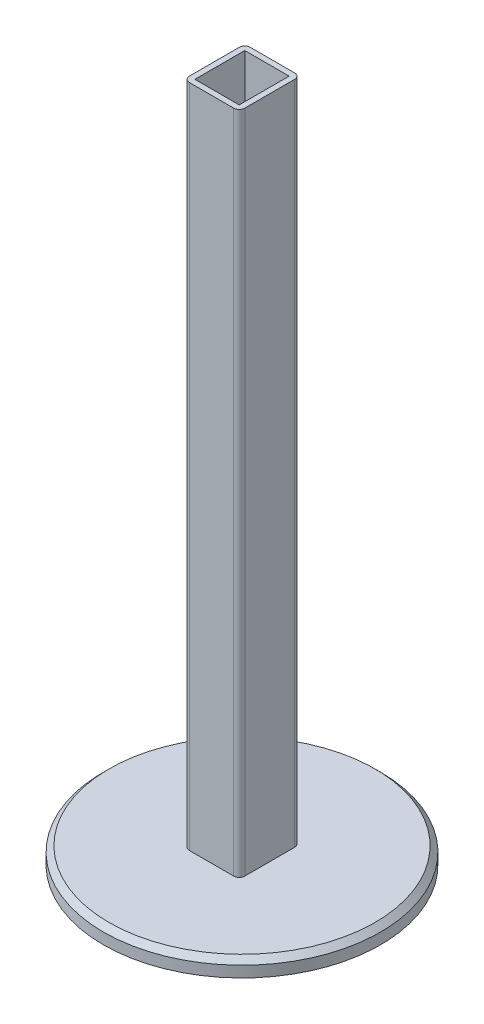
ISO-10303-21;
HEADER;
FILE_DESCRIPTION(('STEP AP214'),'2;1');
FILE_NAME('part.step','',(''),(''),'','','');
FILE_SCHEMA(('AUTOMOTIVE_DESIGN { 1 0 10303 214 1 1 1 1 }'));
ENDSEC;
DATA;
#1=APPLICATION_CONTEXT('core data for automotive mechanical design processes');
#2=APPLICATION_PROTOCOL_DEFINITION('international standard','automotive_design',2000,#1);
#3=PRODUCT_CONTEXT('',#1,'mechanical');
#4=PRODUCT('Part','Part','',(#3));
#5=PRODUCT_RELATED_PRODUCT_CATEGORY('part','',(#4));
#6=PRODUCT_DEFINITION_FORMATION('','',#4);
#7=PRODUCT_DEFINITION_CONTEXT('part definition',#1,'design');
#8=PRODUCT_DEFINITION('design','',#6,#7);
#9=PRODUCT_DEFINITION_SHAPE('','',#8);
#10=(LENGTH_UNIT() NAMED_UNIT(*) SI_UNIT(.MILLI.,.METRE.));
#11=(NAMED_UNIT(*) PLANE_ANGLE_UNIT() SI_UNIT($,.RADIAN.));
#12=(NAMED_UNIT(*) SI_UNIT($,.STERADIAN.) SOLID_ANGLE_UNIT());
#13=UNCERTAINTY_MEASURE_WITH_UNIT(LENGTH_MEASURE(1.E-05),#10,'distance_accuracy_value','');
#14=(GEOMETRIC_REPRESENTATION_CONTEXT(3) GLOBAL_UNCERTAINTY_ASSIGNED_CONTEXT((#13)) GLOBAL_UNIT_ASSIGNED_CONTEXT((#10,
#11,#12)) REPRESENTATION_CONTEXT('',''));
#15=CARTESIAN_POINT('',(0.,0.,0.));
#16=DIRECTION('',(0.,0.,1.));
#17=DIRECTION('',(1.,0.,0.));
#18=AXIS2_PLACEMENT_3D('',#15,#16,#17);
#19=CARTESIAN_POINT('',(0.,30.,0.));
#20=DIRECTION('',(0.,-1.,0.));
#21=DIRECTION('',(0.,0.,-1.));
#22=AXIS2_PLACEMENT_3D('',#19,#20,#21);
#23=CYLINDRICAL_SURFACE('',#22,250.);
#24=CARTESIAN_POINT('',(0.,20.0000000000001,0.));
#25=DIRECTION('',(0.,1.,0.));
#26=DIRECTION('',(0.,0.,1.));
#27=AXIS2_PLACEMENT_3D('',#24,#25,#26);
#28=CIRCLE('',#27,250.);
#29=CARTESIAN_POINT('',(0.,20.0000000000001,250.));
#30=VERTEX_POINT('',#29);
#31=EDGE_CURVE('E190',#30,#30,#28,.F.);
#32=ORIENTED_EDGE('',*,*,#31,.T.);
#33=EDGE_LOOP('',(#32));
#34=FACE_BOUND('',#33,.T.);
#35=CARTESIAN_POINT('',(0.,0.,0.));
#36=DIRECTION('',(0.,1.,0.));
#37=DIRECTION('',(0.,0.,1.));
#38=AXIS2_PLACEMENT_3D('',#35,#36,#37);
#39=CIRCLE('',#38,250.);
#40=CARTESIAN_POINT('',(0.,0.,250.));
#41=VERTEX_POINT('',#40);
#42=EDGE_CURVE('E175',#41,#41,#39,.T.);
#43=ORIENTED_EDGE('',*,*,#42,.T.);
#44=EDGE_LOOP('',(#43));
#45=FACE_BOUND('',#44,.T.);
#46=ADVANCED_FACE('F35',(#34,#45),#23,.T.);
#47=CARTESIAN_POINT('',(0.,30.,0.));
#48=DIRECTION('',(0.,1.,0.));
#49=DIRECTION('',(0.,0.,1.));
#50=AXIS2_PLACEMENT_3D('',#47,#48,#49);
#51=PLANE('',#50);
#52=CARTESIAN_POINT('',(0.,30.,0.));
#53=DIRECTION('',(0.,1.,0.));
#54=DIRECTION('',(0.,0.,1.));
#55=AXIS2_PLACEMENT_3D('',#52,#53,#54);
#56=CIRCLE('',#55,240.);
#57=CARTESIAN_POINT('',(0.,30.,240.));
#58=VERTEX_POINT('',#57);
#59=EDGE_CURVE('E187',#58,#58,#56,.T.);
#60=ORIENTED_EDGE('',*,*,#59,.T.);
#61=EDGE_LOOP('',(#60));
#62=FACE_BOUND('',#61,.T.);
#63=DIRECTION('',(0.,0.,1.));
#64=VECTOR('',#63,1.);
#65=CARTESIAN_POINT('',(-50.,30.,-55.));
#66=LINE('',#65,#64);
#67=CARTESIAN_POINT('',(-50.,30.,-45.));
#68=VERTEX_POINT('',#67);
#69=CARTESIAN_POINT('',(-50.,30.,45.));
#70=VERTEX_POINT('',#69);
#71=EDGE_CURVE('E158',#68,#70,#66,.T.);
#72=ORIENTED_EDGE('',*,*,#71,.F.);
#73=CARTESIAN_POINT('',(-40.,30.,-45.));
#74=DIRECTION('',(0.,1.,0.));
#75=DIRECTION('',(0.,0.,1.));
#76=AXIS2_PLACEMENT_3D('',#73,#74,#75);
#77=CIRCLE('',#76,10.);
#78=CARTESIAN_POINT('',(-40.,30.,-55.));
#79=VERTEX_POINT('',#78);
#80=EDGE_CURVE('E221',#68,#79,#77,.F.);
#81=ORIENTED_EDGE('',*,*,#80,.T.);
#82=DIRECTION('',(-1.,0.,0.));
#83=VECTOR('',#82,1.);
#84=CARTESIAN_POINT('',(50.,30.,-55.));
#85=LINE('',#84,#83);
#86=CARTESIAN_POINT('',(40.,30.,-55.));
#87=VERTEX_POINT('',#86);
#88=EDGE_CURVE('E166',#87,#79,#85,.T.);
#89=ORIENTED_EDGE('',*,*,#88,.F.);
#90=CARTESIAN_POINT('',(40.,30.,-45.));
#91=DIRECTION('',(0.,1.,0.));
#92=DIRECTION('',(0.,0.,1.));
#93=AXIS2_PLACEMENT_3D('',#90,#91,#92);
#94=CIRCLE('',#93,10.);
#95=CARTESIAN_POINT('',(50.,30.,-45.));
#96=VERTEX_POINT('',#95);
#97=EDGE_CURVE('E43',#87,#96,#94,.F.);
#98=ORIENTED_EDGE('',*,*,#97,.T.);
#99=DIRECTION('',(0.,0.,-1.));
#100=VECTOR('',#99,1.);
#101=CARTESIAN_POINT('',(50.,30.,-55.));
#102=LINE('',#101,#100);
#103=CARTESIAN_POINT('',(50.,30.,45.));
#104=VERTEX_POINT('',#103);
#105=EDGE_CURVE('E181',#104,#96,#102,.T.);
#106=ORIENTED_EDGE('',*,*,#105,.F.);
#107=CARTESIAN_POINT('',(40.,30.,45.));
#108=DIRECTION('',(0.,1.,0.));
#109=DIRECTION('',(0.,0.,1.));
#110=AXIS2_PLACEMENT_3D('',#107,#108,#109);
#111=CIRCLE('',#110,10.);
#112=CARTESIAN_POINT('',(40.,30.,55.));
#113=VERTEX_POINT('',#112);
#114=EDGE_CURVE('E11',#104,#113,#111,.F.);
#115=ORIENTED_EDGE('',*,*,#114,.T.);
#116=DIRECTION('',(1.,0.,0.));
#117=VECTOR('',#116,1.);
#118=CARTESIAN_POINT('',(50.,30.,55.));
#119=LINE('',#118,#117);
#120=CARTESIAN_POINT('',(-40.,30.,55.));
#121=VERTEX_POINT('',#120);
#122=EDGE_CURVE('E178',#121,#113,#119,.T.);
#123=ORIENTED_EDGE('',*,*,#122,.F.);
#124=CARTESIAN_POINT('',(-40.,30.,45.));
#125=DIRECTION('',(0.,1.,0.));
#126=DIRECTION('',(0.,0.,1.));
#127=AXIS2_PLACEMENT_3D('',#124,#125,#126);
#128=CIRCLE('',#127,10.);
#129=EDGE_CURVE('E223',#121,#70,#128,.F.);
#130=ORIENTED_EDGE('',*,*,#129,.T.);
#131=EDGE_LOOP('',(#72,#81,#89,#98,#106,#115,#123,#130));
#132=FACE_BOUND('',#131,.T.);
#133=ADVANCED_FACE('F226',(#62,#132),#51,.T.);
#134=CARTESIAN_POINT('',(0.,0.,0.));
#135=DIRECTION('',(0.,1.,0.));
#136=DIRECTION('',(0.,0.,1.));
#137=AXIS2_PLACEMENT_3D('',#134,#135,#136);
#138=PLANE('',#137);
#139=ORIENTED_EDGE('',*,*,#42,.F.);
#140=EDGE_LOOP('',(#139));
#141=FACE_BOUND('',#140,.T.);
#142=ADVANCED_FACE('F276',(#141),#138,.F.);
#143=CARTESIAN_POINT('',(-50.,1230.,-55.));
#144=DIRECTION('',(1.,0.,0.));
#145=DIRECTION('',(0.,0.,-1.));
#146=AXIS2_PLACEMENT_3D('',#143,#144,#145);
#147=PLANE('',#146);
#148=DIRECTION('',(0.,0.,1.));
#149=VECTOR('',#148,1.);
#150=CARTESIAN_POINT('',(-50.,1230.,-55.));
#151=LINE('',#150,#149);
#152=CARTESIAN_POINT('',(-50.,1230.,-45.));
#153=VERTEX_POINT('',#152);
#154=CARTESIAN_POINT('',(-50.,1230.,45.));
#155=VERTEX_POINT('',#154);
#156=EDGE_CURVE('E162',#153,#155,#151,.T.);
#157=ORIENTED_EDGE('',*,*,#156,.F.);
#158=DIRECTION('',(0.,-1.,0.));
#159=VECTOR('',#158,1.);
#160=CARTESIAN_POINT('',(-50.,1230.,-45.));
#161=LINE('',#160,#159);
#162=EDGE_CURVE('E195',#153,#68,#161,.T.);
#163=ORIENTED_EDGE('',*,*,#162,.T.);
#164=ORIENTED_EDGE('',*,*,#71,.T.);
#165=DIRECTION('',(0.,-1.,0.));
#166=VECTOR('',#165,1.);
#167=CARTESIAN_POINT('',(-50.,1230.,45.));
#168=LINE('',#167,#166);
#169=EDGE_CURVE('E193',#70,#155,#168,.F.);
#170=ORIENTED_EDGE('',*,*,#169,.T.);
#171=EDGE_LOOP('',(#157,#163,#164,#170));
#172=FACE_BOUND('',#171,.T.);
#173=ADVANCED_FACE('F232',(#172),#147,.F.);
#174=CARTESIAN_POINT('',(50.,1230.,55.));
#175=DIRECTION('',(0.,0.,-1.));
#176=DIRECTION('',(-1.,0.,0.));
#177=AXIS2_PLACEMENT_3D('',#174,#175,#176);
#178=PLANE('',#177);
#179=DIRECTION('',(1.,0.,0.));
#180=VECTOR('',#179,1.);
#181=CARTESIAN_POINT('',(50.,1230.,55.));
#182=LINE('',#181,#180);
#183=CARTESIAN_POINT('',(-40.,1230.,55.));
#184=VERTEX_POINT('',#183);
#185=CARTESIAN_POINT('',(40.,1230.,55.));
#186=VERTEX_POINT('',#185);
#187=EDGE_CURVE('E165',#184,#186,#182,.T.);
#188=ORIENTED_EDGE('',*,*,#187,.F.);
#189=DIRECTION('',(0.,-1.,0.));
#190=VECTOR('',#189,1.);
#191=CARTESIAN_POINT('',(-40.,1230.,55.));
#192=LINE('',#191,#190);
#193=EDGE_CURVE('E213',#184,#121,#192,.T.);
#194=ORIENTED_EDGE('',*,*,#193,.T.);
#195=ORIENTED_EDGE('',*,*,#122,.T.);
#196=DIRECTION('',(0.,-1.,0.));
#197=VECTOR('',#196,1.);
#198=CARTESIAN_POINT('',(40.,1230.,55.));
#199=LINE('',#198,#197);
#200=EDGE_CURVE('E211',#113,#186,#199,.F.);
#201=ORIENTED_EDGE('',*,*,#200,.T.);
#202=EDGE_LOOP('',(#188,#194,#195,#201));
#203=FACE_BOUND('',#202,.T.);
#204=ADVANCED_FACE('F241',(#203),#178,.F.);
#205=CARTESIAN_POINT('',(50.,1230.,-55.));
#206=DIRECTION('',(-1.,0.,0.));
#207=DIRECTION('',(0.,0.,1.));
#208=AXIS2_PLACEMENT_3D('',#205,#206,#207);
#209=PLANE('',#208);
#210=ORIENTED_EDGE('',*,*,#105,.T.);
#211=DIRECTION('',(0.,-1.,0.));
#212=VECTOR('',#211,1.);
#213=CARTESIAN_POINT('',(50.,1230.,-45.));
#214=LINE('',#213,#212);
#215=CARTESIAN_POINT('',(50.,1230.,-45.));
#216=VERTEX_POINT('',#215);
#217=EDGE_CURVE('E219',#96,#216,#214,.F.);
#218=ORIENTED_EDGE('',*,*,#217,.T.);
#219=DIRECTION('',(0.,0.,-1.));
#220=VECTOR('',#219,1.);
#221=CARTESIAN_POINT('',(50.,1230.,-55.));
#222=LINE('',#221,#220);
#223=CARTESIAN_POINT('',(50.,1230.,45.));
#224=VERTEX_POINT('',#223);
#225=EDGE_CURVE('E169',#224,#216,#222,.T.);
#226=ORIENTED_EDGE('',*,*,#225,.F.);
#227=DIRECTION('',(0.,-1.,0.));
#228=VECTOR('',#227,1.);
#229=CARTESIAN_POINT('',(50.,1230.,45.));
#230=LINE('',#229,#228);
#231=EDGE_CURVE('E216',#224,#104,#230,.T.);
#232=ORIENTED_EDGE('',*,*,#231,.T.);
#233=EDGE_LOOP('',(#210,#218,#226,#232));
#234=FACE_BOUND('',#233,.T.);
#235=ADVANCED_FACE('F248',(#234),#209,.F.);
#236=CARTESIAN_POINT('',(50.,1230.,-55.));
#237=DIRECTION('',(0.,0.,1.));
#238=DIRECTION('',(1.,0.,0.));
#239=AXIS2_PLACEMENT_3D('',#236,#237,#238);
#240=PLANE('',#239);
#241=ORIENTED_EDGE('',*,*,#88,.T.);
#242=DIRECTION('',(0.,-1.,0.));
#243=VECTOR('',#242,1.);
#244=CARTESIAN_POINT('',(-40.,1230.,-55.));
#245=LINE('',#244,#243);
#246=CARTESIAN_POINT('',(-40.,1230.,-55.));
#247=VERTEX_POINT('',#246);
#248=EDGE_CURVE('E201',#79,#247,#245,.F.);
#249=ORIENTED_EDGE('',*,*,#248,.T.);
#250=DIRECTION('',(-1.,0.,0.));
#251=VECTOR('',#250,1.);
#252=CARTESIAN_POINT('',(50.,1230.,-55.));
#253=LINE('',#252,#251);
#254=CARTESIAN_POINT('',(40.,1230.,-55.));
#255=VERTEX_POINT('',#254);
#256=EDGE_CURVE('E172',#255,#247,#253,.T.);
#257=ORIENTED_EDGE('',*,*,#256,.F.);
#258=DIRECTION('',(0.,-1.,0.));
#259=VECTOR('',#258,1.);
#260=CARTESIAN_POINT('',(40.,1230.,-55.));
#261=LINE('',#260,#259);
#262=EDGE_CURVE('E198',#255,#87,#261,.T.);
#263=ORIENTED_EDGE('',*,*,#262,.T.);
#264=EDGE_LOOP('',(#241,#249,#257,#263));
#265=FACE_BOUND('',#264,.T.);
#266=ADVANCED_FACE('F256',(#265),#240,.F.);
#267=CARTESIAN_POINT('',(0.,1230.,0.));
#268=DIRECTION('',(0.,-1.,0.));
#269=DIRECTION('',(0.,0.,-1.));
#270=AXIS2_PLACEMENT_3D('',#267,#268,#269);
#271=PLANE('',#270);
#272=DIRECTION('',(1.,0.,0.));
#273=VECTOR('',#272,1.);
#274=CARTESIAN_POINT('',(40.,1230.,45.));
#275=LINE('',#274,#273);
#276=CARTESIAN_POINT('',(-40.,1230.,45.));
#277=VERTEX_POINT('',#276);
#278=CARTESIAN_POINT('',(40.,1230.,45.));
#279=VERTEX_POINT('',#278);
#280=EDGE_CURVE('E152',#277,#279,#275,.T.);
#281=ORIENTED_EDGE('',*,*,#280,.F.);
#282=DIRECTION('',(0.,0.,1.));
#283=VECTOR('',#282,1.);
#284=CARTESIAN_POINT('',(-40.,1230.,-45.));
#285=LINE('',#284,#283);
#286=CARTESIAN_POINT('',(-40.,1230.,-45.));
#287=VERTEX_POINT('',#286);
#288=EDGE_CURVE('E50',#287,#277,#285,.T.);
#289=ORIENTED_EDGE('',*,*,#288,.F.);
#290=DIRECTION('',(-1.,0.,0.));
#291=VECTOR('',#290,1.);
#292=CARTESIAN_POINT('',(40.,1230.,-45.));
#293=LINE('',#292,#291);
#294=CARTESIAN_POINT('',(40.,1230.,-45.));
#295=VERTEX_POINT('',#294);
#296=EDGE_CURVE('E143',#295,#287,#293,.T.);
#297=ORIENTED_EDGE('',*,*,#296,.F.);
#298=DIRECTION('',(0.,0.,-1.));
#299=VECTOR('',#298,1.);
#300=CARTESIAN_POINT('',(40.,1230.,-45.));
#301=LINE('',#300,#299);
#302=EDGE_CURVE('E146',#279,#295,#301,.T.);
#303=ORIENTED_EDGE('',*,*,#302,.F.);
#304=EDGE_LOOP('',(#281,#289,#297,#303));
#305=FACE_BOUND('',#304,.T.);
#306=ORIENTED_EDGE('',*,*,#256,.T.);
#307=CARTESIAN_POINT('',(-40.,1230.,-45.));
#308=DIRECTION('',(0.,-1.,0.));
#309=DIRECTION('',(0.,0.,-1.));
#310=AXIS2_PLACEMENT_3D('',#307,#308,#309);
#311=CIRCLE('',#310,10.);
#312=EDGE_CURVE('E209',#247,#153,#311,.F.);
#313=ORIENTED_EDGE('',*,*,#312,.T.);
#314=ORIENTED_EDGE('',*,*,#156,.T.);
#315=CARTESIAN_POINT('',(-40.,1230.,45.));
#316=DIRECTION('',(0.,-1.,0.));
#317=DIRECTION('',(0.,0.,-1.));
#318=AXIS2_PLACEMENT_3D('',#315,#316,#317);
#319=CIRCLE('',#318,10.);
#320=EDGE_CURVE('E207',#155,#184,#319,.F.);
#321=ORIENTED_EDGE('',*,*,#320,.T.);
#322=ORIENTED_EDGE('',*,*,#187,.T.);
#323=CARTESIAN_POINT('',(40.,1230.,45.));
#324=DIRECTION('',(0.,-1.,0.));
#325=DIRECTION('',(0.,0.,-1.));
#326=AXIS2_PLACEMENT_3D('',#323,#324,#325);
#327=CIRCLE('',#326,10.);
#328=EDGE_CURVE('E203',#186,#224,#327,.F.);
#329=ORIENTED_EDGE('',*,*,#328,.T.);
#330=ORIENTED_EDGE('',*,*,#225,.T.);
#331=CARTESIAN_POINT('',(40.,1230.,-45.));
#332=DIRECTION('',(0.,-1.,0.));
#333=DIRECTION('',(0.,0.,-1.));
#334=AXIS2_PLACEMENT_3D('',#331,#332,#333);
#335=CIRCLE('',#334,10.);
#336=EDGE_CURVE('E205',#216,#255,#335,.F.);
#337=ORIENTED_EDGE('',*,*,#336,.T.);
#338=EDGE_LOOP('',(#306,#313,#314,#321,#322,#329,#330,#337));
#339=FACE_BOUND('',#338,.T.);
#340=ADVANCED_FACE('F238',(#305,#339),#271,.F.);
#341=CARTESIAN_POINT('',(0.,30.,0.));
#342=DIRECTION('',(0.,-1.,0.));
#343=DIRECTION('',(0.,0.,-1.));
#344=AXIS2_PLACEMENT_3D('',#341,#342,#343);
#345=CONICAL_SURFACE('',#344,240.,0.785398163397443);
#346=ORIENTED_EDGE('',*,*,#31,.F.);
#347=EDGE_LOOP('',(#346));
#348=FACE_BOUND('',#347,.T.);
#349=ORIENTED_EDGE('',*,*,#59,.F.);
#350=EDGE_LOOP('',(#349));
#351=FACE_BOUND('',#350,.T.);
#352=ADVANCED_FACE('F261',(#348,#351),#345,.T.);
#353=CARTESIAN_POINT('',(-40.,1230.,-45.));
#354=DIRECTION('',(0.,-1.,0.));
#355=DIRECTION('',(0.,0.,-1.));
#356=AXIS2_PLACEMENT_3D('',#353,#354,#355);
#357=CYLINDRICAL_SURFACE('',#356,10.);
#358=ORIENTED_EDGE('',*,*,#312,.F.);
#359=ORIENTED_EDGE('',*,*,#248,.F.);
#360=ORIENTED_EDGE('',*,*,#80,.F.);
#361=ORIENTED_EDGE('',*,*,#162,.F.);
#362=EDGE_LOOP('',(#358,#359,#360,#361));
#363=FACE_BOUND('',#362,.T.);
#364=ADVANCED_FACE('F259',(#363),#357,.T.);
#365=CARTESIAN_POINT('',(-40.,1230.,45.));
#366=DIRECTION('',(0.,-1.,0.));
#367=DIRECTION('',(0.,0.,-1.));
#368=AXIS2_PLACEMENT_3D('',#365,#366,#367);
#369=CYLINDRICAL_SURFACE('',#368,10.);
#370=ORIENTED_EDGE('',*,*,#320,.F.);
#371=ORIENTED_EDGE('',*,*,#169,.F.);
#372=ORIENTED_EDGE('',*,*,#129,.F.);
#373=ORIENTED_EDGE('',*,*,#193,.F.);
#374=EDGE_LOOP('',(#370,#371,#372,#373));
#375=FACE_BOUND('',#374,.T.);
#376=ADVANCED_FACE('F235',(#375),#369,.T.);
#377=CARTESIAN_POINT('',(40.,1230.,-45.));
#378=DIRECTION('',(0.,-1.,0.));
#379=DIRECTION('',(0.,0.,-1.));
#380=AXIS2_PLACEMENT_3D('',#377,#378,#379);
#381=CYLINDRICAL_SURFACE('',#380,10.);
#382=ORIENTED_EDGE('',*,*,#336,.F.);
#383=ORIENTED_EDGE('',*,*,#217,.F.);
#384=ORIENTED_EDGE('',*,*,#97,.F.);
#385=ORIENTED_EDGE('',*,*,#262,.F.);
#386=EDGE_LOOP('',(#382,#383,#384,#385));
#387=FACE_BOUND('',#386,.T.);
#388=ADVANCED_FACE('F251',(#387),#381,.T.);
#389=CARTESIAN_POINT('',(40.,1230.,45.));
#390=DIRECTION('',(0.,-1.,0.));
#391=DIRECTION('',(0.,0.,-1.));
#392=AXIS2_PLACEMENT_3D('',#389,#390,#391);
#393=CYLINDRICAL_SURFACE('',#392,10.);
#394=ORIENTED_EDGE('',*,*,#328,.F.);
#395=ORIENTED_EDGE('',*,*,#200,.F.);
#396=ORIENTED_EDGE('',*,*,#114,.F.);
#397=ORIENTED_EDGE('',*,*,#231,.F.);
#398=EDGE_LOOP('',(#394,#395,#396,#397));
#399=FACE_BOUND('',#398,.T.);
#400=ADVANCED_FACE('F37',(#399),#393,.T.);
#401=CARTESIAN_POINT('',(-40.,60.0000000000001,-45.));
#402=DIRECTION('',(-1.,0.,0.));
#403=DIRECTION('',(0.,0.,1.));
#404=AXIS2_PLACEMENT_3D('',#401,#402,#403);
#405=PLANE('',#404);
#406=ORIENTED_EDGE('',*,*,#288,.T.);
#407=DIRECTION('',(0.,1.,0.));
#408=VECTOR('',#407,1.);
#409=CARTESIAN_POINT('',(-40.,60.0000000000001,45.));
#410=LINE('',#409,#408);
#411=CARTESIAN_POINT('',(-40.,60.0000000000001,45.));
#412=VERTEX_POINT('',#411);
#413=EDGE_CURVE('E121',#412,#277,#410,.T.);
#414=ORIENTED_EDGE('',*,*,#413,.F.);
#415=DIRECTION('',(0.,0.,1.));
#416=VECTOR('',#415,1.);
#417=CARTESIAN_POINT('',(-40.,60.0000000000001,-45.));
#418=LINE('',#417,#416);
#419=CARTESIAN_POINT('',(-40.,60.0000000000001,-45.));
#420=VERTEX_POINT('',#419);
#421=EDGE_CURVE('E125',#420,#412,#418,.T.);
#422=ORIENTED_EDGE('',*,*,#421,.F.);
#423=DIRECTION('',(0.,1.,0.));
#424=VECTOR('',#423,1.);
#425=CARTESIAN_POINT('',(-40.,60.0000000000001,-45.));
#426=LINE('',#425,#424);
#427=EDGE_CURVE('E156',#420,#287,#426,.T.);
#428=ORIENTED_EDGE('',*,*,#427,.T.);
#429=EDGE_LOOP('',(#406,#414,#422,#428));
#430=FACE_BOUND('',#429,.T.);
#431=ADVANCED_FACE('F123',(#430),#405,.F.);
#432=CARTESIAN_POINT('',(40.,60.0000000000001,-45.));
#433=DIRECTION('',(0.,0.,-1.));
#434=DIRECTION('',(-1.,0.,0.));
#435=AXIS2_PLACEMENT_3D('',#432,#433,#434);
#436=PLANE('',#435);
#437=ORIENTED_EDGE('',*,*,#296,.T.);
#438=ORIENTED_EDGE('',*,*,#427,.F.);
#439=DIRECTION('',(-1.,0.,0.));
#440=VECTOR('',#439,1.);
#441=CARTESIAN_POINT('',(40.,60.0000000000001,-45.));
#442=LINE('',#441,#440);
#443=CARTESIAN_POINT('',(40.,60.0000000000001,-45.));
#444=VERTEX_POINT('',#443);
#445=EDGE_CURVE('E131',#444,#420,#442,.T.);
#446=ORIENTED_EDGE('',*,*,#445,.F.);
#447=DIRECTION('',(0.,1.,0.));
#448=VECTOR('',#447,1.);
#449=CARTESIAN_POINT('',(40.,60.0000000000001,-45.));
#450=LINE('',#449,#448);
#451=EDGE_CURVE('E159',#444,#295,#450,.T.);
#452=ORIENTED_EDGE('',*,*,#451,.T.);
#453=EDGE_LOOP('',(#437,#438,#446,#452));
#454=FACE_BOUND('',#453,.T.);
#455=ADVANCED_FACE('F300',(#454),#436,.F.);
#456=CARTESIAN_POINT('',(40.,60.0000000000001,-45.));
#457=DIRECTION('',(1.,0.,0.));
#458=DIRECTION('',(0.,0.,-1.));
#459=AXIS2_PLACEMENT_3D('',#456,#457,#458);
#460=PLANE('',#459);
#461=ORIENTED_EDGE('',*,*,#302,.T.);
#462=ORIENTED_EDGE('',*,*,#451,.F.);
#463=DIRECTION('',(0.,0.,-1.));
#464=VECTOR('',#463,1.);
#465=CARTESIAN_POINT('',(40.,60.0000000000001,-45.));
#466=LINE('',#465,#464);
#467=CARTESIAN_POINT('',(40.,60.0000000000001,45.));
#468=VERTEX_POINT('',#467);
#469=EDGE_CURVE('E139',#468,#444,#466,.T.);
#470=ORIENTED_EDGE('',*,*,#469,.F.);
#471=DIRECTION('',(0.,1.,0.));
#472=VECTOR('',#471,1.);
#473=CARTESIAN_POINT('',(40.,60.0000000000001,45.));
#474=LINE('',#473,#472);
#475=EDGE_CURVE('E130',#468,#279,#474,.T.);
#476=ORIENTED_EDGE('',*,*,#475,.T.);
#477=EDGE_LOOP('',(#461,#462,#470,#476));
#478=FACE_BOUND('',#477,.T.);
#479=ADVANCED_FACE('F303',(#478),#460,.F.);
#480=CARTESIAN_POINT('',(40.,60.0000000000001,45.));
#481=DIRECTION('',(0.,0.,1.));
#482=DIRECTION('',(1.,0.,0.));
#483=AXIS2_PLACEMENT_3D('',#480,#481,#482);
#484=PLANE('',#483);
#485=ORIENTED_EDGE('',*,*,#280,.T.);
#486=ORIENTED_EDGE('',*,*,#475,.F.);
#487=DIRECTION('',(1.,0.,0.));
#488=VECTOR('',#487,1.);
#489=CARTESIAN_POINT('',(40.,60.0000000000001,45.));
#490=LINE('',#489,#488);
#491=EDGE_CURVE('E134',#412,#468,#490,.T.);
#492=ORIENTED_EDGE('',*,*,#491,.F.);
#493=ORIENTED_EDGE('',*,*,#413,.T.);
#494=EDGE_LOOP('',(#485,#486,#492,#493));
#495=FACE_BOUND('',#494,.T.);
#496=ADVANCED_FACE('F135',(#495),#484,.F.);
#497=CARTESIAN_POINT('',(0.,60.0000000000001,0.));
#498=DIRECTION('',(0.,-1.,0.));
#499=DIRECTION('',(0.,0.,-1.));
#500=AXIS2_PLACEMENT_3D('',#497,#498,#499);
#501=PLANE('',#500);
#502=ORIENTED_EDGE('',*,*,#421,.T.);
#503=ORIENTED_EDGE('',*,*,#491,.T.);
#504=ORIENTED_EDGE('',*,*,#469,.T.);
#505=ORIENTED_EDGE('',*,*,#445,.T.);
#506=EDGE_LOOP('',(#502,#503,#504,#505));
#507=FACE_BOUND('',#506,.T.);
#508=ADVANCED_FACE('F141',(#507),#501,.F.);
#509=CLOSED_SHELL('',(#46,#133,#142,#173,#204,#235,#266,#340,#352,#364,#376,#388,#400,#431,#455,
#479,#496,#508));
#510=MANIFOLD_SOLID_BREP('B2',#509);
#511=ADVANCED_BREP_SHAPE_REPRESENTATION('',(#18,#510),#14);
#512=SHAPE_DEFINITION_REPRESENTATION(#9,#511);
ENDSEC;
END-ISO-10303-21;
